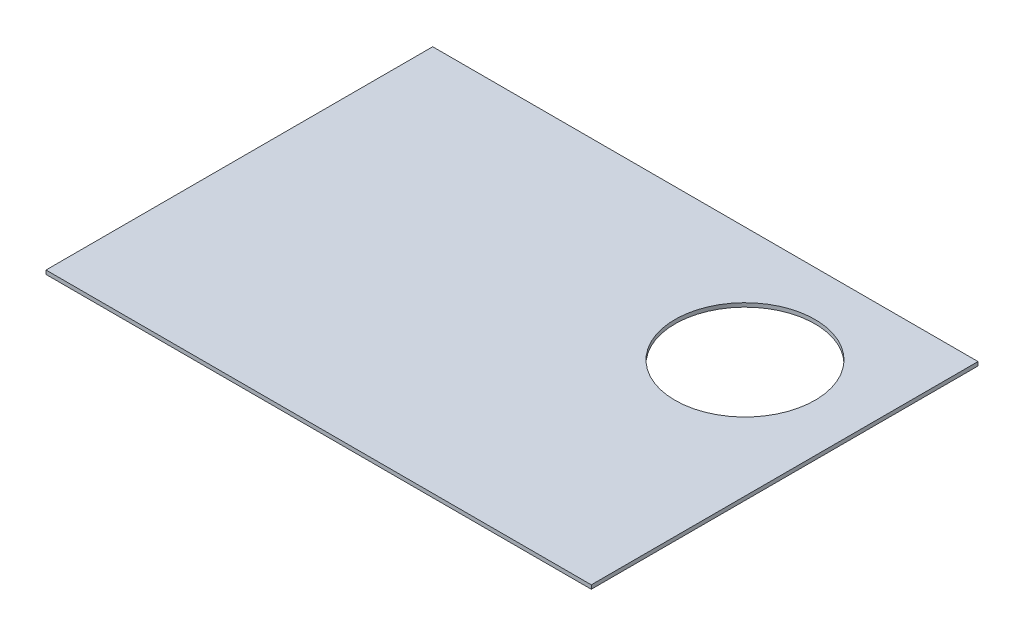
ISO-10303-21;
HEADER;
FILE_DESCRIPTION(('STEP AP214'),'2;1');
FILE_NAME('part.step','',(''),(''),'','','');
FILE_SCHEMA(('AUTOMOTIVE_DESIGN { 1 0 10303 214 1 1 1 1 }'));
ENDSEC;
DATA;
#1=APPLICATION_CONTEXT('core data for automotive mechanical design processes');
#2=APPLICATION_PROTOCOL_DEFINITION('international standard','automotive_design',2000,#1);
#3=PRODUCT_CONTEXT('',#1,'mechanical');
#4=PRODUCT('Part','Part','',(#3));
#5=PRODUCT_RELATED_PRODUCT_CATEGORY('part','',(#4));
#6=PRODUCT_DEFINITION_FORMATION('','',#4);
#7=PRODUCT_DEFINITION_CONTEXT('part definition',#1,'design');
#8=PRODUCT_DEFINITION('design','',#6,#7);
#9=PRODUCT_DEFINITION_SHAPE('','',#8);
#10=(LENGTH_UNIT() NAMED_UNIT(*) SI_UNIT(.MILLI.,.METRE.));
#11=(NAMED_UNIT(*) PLANE_ANGLE_UNIT() SI_UNIT($,.RADIAN.));
#12=(NAMED_UNIT(*) SI_UNIT($,.STERADIAN.) SOLID_ANGLE_UNIT());
#13=UNCERTAINTY_MEASURE_WITH_UNIT(LENGTH_MEASURE(1.E-05),#10,'distance_accuracy_value','');
#14=(GEOMETRIC_REPRESENTATION_CONTEXT(3) GLOBAL_UNCERTAINTY_ASSIGNED_CONTEXT((#13)) GLOBAL_UNIT_ASSIGNED_CONTEXT((#10,
#11,#12)) REPRESENTATION_CONTEXT('',''));
#15=CARTESIAN_POINT('',(0.,0.,0.));
#16=DIRECTION('',(0.,0.,1.));
#17=DIRECTION('',(1.,0.,0.));
#18=AXIS2_PLACEMENT_3D('',#15,#16,#17);
#19=CARTESIAN_POINT('',(0.,3.175,0.));
#20=DIRECTION('',(1.,0.,0.));
#21=DIRECTION('',(0.,0.,-1.));
#22=AXIS2_PLACEMENT_3D('',#19,#20,#21);
#23=PLANE('',#22);
#24=DIRECTION('',(0.,0.,1.));
#25=VECTOR('',#24,1.);
#26=CARTESIAN_POINT('',(0.,0.,0.));
#27=LINE('',#26,#25);
#28=CARTESIAN_POINT('',(0.,0.,-317.5));
#29=VERTEX_POINT('',#28);
#30=CARTESIAN_POINT('',(0.,0.,0.));
#31=VERTEX_POINT('',#30);
#32=EDGE_CURVE('E106',#29,#31,#27,.T.);
#33=ORIENTED_EDGE('',*,*,#32,.T.);
#34=DIRECTION('',(0.,-1.,0.));
#35=VECTOR('',#34,1.);
#36=CARTESIAN_POINT('',(0.,3.175,0.));
#37=LINE('',#36,#35);
#38=CARTESIAN_POINT('',(0.,3.175,0.));
#39=VERTEX_POINT('',#38);
#40=EDGE_CURVE('E11',#39,#31,#37,.T.);
#41=ORIENTED_EDGE('',*,*,#40,.F.);
#42=DIRECTION('',(0.,0.,1.));
#43=VECTOR('',#42,1.);
#44=CARTESIAN_POINT('',(0.,3.175,0.));
#45=LINE('',#44,#43);
#46=CARTESIAN_POINT('',(0.,3.175,-317.5));
#47=VERTEX_POINT('',#46);
#48=EDGE_CURVE('E92',#47,#39,#45,.T.);
#49=ORIENTED_EDGE('',*,*,#48,.F.);
#50=DIRECTION('',(0.,-1.,0.));
#51=VECTOR('',#50,1.);
#52=CARTESIAN_POINT('',(0.,3.175,-317.5));
#53=LINE('',#52,#51);
#54=EDGE_CURVE('E105',#47,#29,#53,.T.);
#55=ORIENTED_EDGE('',*,*,#54,.T.);
#56=EDGE_LOOP('',(#33,#41,#49,#55));
#57=FACE_BOUND('',#56,.T.);
#58=ADVANCED_FACE('F43',(#57),#23,.F.);
#59=CARTESIAN_POINT('',(401.6375,3.175,0.));
#60=DIRECTION('',(0.,0.,-1.));
#61=DIRECTION('',(-1.,0.,0.));
#62=AXIS2_PLACEMENT_3D('',#59,#60,#61);
#63=PLANE('',#62);
#64=DIRECTION('',(1.,0.,0.));
#65=VECTOR('',#64,1.);
#66=CARTESIAN_POINT('',(401.6375,0.,0.));
#67=LINE('',#66,#65);
#68=CARTESIAN_POINT('',(447.675,0.,0.));
#69=VERTEX_POINT('',#68);
#70=EDGE_CURVE('E96',#31,#69,#67,.T.);
#71=ORIENTED_EDGE('',*,*,#70,.T.);
#72=DIRECTION('',(0.,-1.,0.));
#73=VECTOR('',#72,1.);
#74=CARTESIAN_POINT('',(447.675,3.175,0.));
#75=LINE('',#74,#73);
#76=CARTESIAN_POINT('',(447.675,3.175,0.));
#77=VERTEX_POINT('',#76);
#78=EDGE_CURVE('E51',#77,#69,#75,.T.);
#79=ORIENTED_EDGE('',*,*,#78,.F.);
#80=DIRECTION('',(1.,0.,0.));
#81=VECTOR('',#80,1.);
#82=CARTESIAN_POINT('',(0.,3.175,0.));
#83=LINE('',#82,#81);
#84=EDGE_CURVE('E89',#39,#77,#83,.T.);
#85=ORIENTED_EDGE('',*,*,#84,.F.);
#86=ORIENTED_EDGE('',*,*,#40,.T.);
#87=EDGE_LOOP('',(#71,#79,#85,#86));
#88=FACE_BOUND('',#87,.T.);
#89=ADVANCED_FACE('F97',(#88),#63,.F.);
#90=CARTESIAN_POINT('',(447.675,3.175,0.));
#91=DIRECTION('',(-1.,0.,0.));
#92=DIRECTION('',(0.,0.,1.));
#93=AXIS2_PLACEMENT_3D('',#90,#91,#92);
#94=PLANE('',#93);
#95=DIRECTION('',(0.,0.,-1.));
#96=VECTOR('',#95,1.);
#97=CARTESIAN_POINT('',(447.675,0.,0.));
#98=LINE('',#97,#96);
#99=CARTESIAN_POINT('',(447.675,0.,-317.5));
#100=VERTEX_POINT('',#99);
#101=EDGE_CURVE('E77',#69,#100,#98,.T.);
#102=ORIENTED_EDGE('',*,*,#101,.T.);
#103=DIRECTION('',(0.,-1.,0.));
#104=VECTOR('',#103,1.);
#105=CARTESIAN_POINT('',(447.675,3.175,-317.5));
#106=LINE('',#105,#104);
#107=CARTESIAN_POINT('',(447.675,3.175,-317.5));
#108=VERTEX_POINT('',#107);
#109=EDGE_CURVE('E100',#108,#100,#106,.T.);
#110=ORIENTED_EDGE('',*,*,#109,.F.);
#111=DIRECTION('',(0.,0.,-1.));
#112=VECTOR('',#111,1.);
#113=CARTESIAN_POINT('',(447.675,3.175,0.));
#114=LINE('',#113,#112);
#115=EDGE_CURVE('E95',#77,#108,#114,.T.);
#116=ORIENTED_EDGE('',*,*,#115,.F.);
#117=ORIENTED_EDGE('',*,*,#78,.T.);
#118=EDGE_LOOP('',(#102,#110,#116,#117));
#119=FACE_BOUND('',#118,.T.);
#120=ADVANCED_FACE('F99',(#119),#94,.F.);
#121=CARTESIAN_POINT('',(0.,3.175,-317.5));
#122=DIRECTION('',(0.,0.,1.));
#123=DIRECTION('',(1.,0.,0.));
#124=AXIS2_PLACEMENT_3D('',#121,#122,#123);
#125=PLANE('',#124);
#126=DIRECTION('',(-1.,0.,0.));
#127=VECTOR('',#126,1.);
#128=CARTESIAN_POINT('',(0.,0.,-317.5));
#129=LINE('',#128,#127);
#130=EDGE_CURVE('E81',#100,#29,#129,.T.);
#131=ORIENTED_EDGE('',*,*,#130,.T.);
#132=ORIENTED_EDGE('',*,*,#54,.F.);
#133=DIRECTION('',(-1.,0.,0.));
#134=VECTOR('',#133,1.);
#135=CARTESIAN_POINT('',(0.,3.175,-317.5));
#136=LINE('',#135,#134);
#137=EDGE_CURVE('E56',#108,#47,#136,.T.);
#138=ORIENTED_EDGE('',*,*,#137,.F.);
#139=ORIENTED_EDGE('',*,*,#109,.T.);
#140=EDGE_LOOP('',(#131,#132,#138,#139));
#141=FACE_BOUND('',#140,.T.);
#142=ADVANCED_FACE('F112',(#141),#125,.F.);
#143=CARTESIAN_POINT('',(0.,3.175,0.));
#144=DIRECTION('',(0.,-1.,0.));
#145=DIRECTION('',(0.,0.,-1.));
#146=AXIS2_PLACEMENT_3D('',#143,#144,#145);
#147=PLANE('',#146);
#148=CARTESIAN_POINT('',(350.8375,3.175,-223.04375));
#149=DIRECTION('',(0.,1.,0.));
#150=DIRECTION('',(0.,0.,1.));
#151=AXIS2_PLACEMENT_3D('',#148,#149,#150);
#152=CIRCLE('',#151,57.5);
#153=CARTESIAN_POINT('',(350.8375,3.175,-165.54375));
#154=VERTEX_POINT('',#153);
#155=EDGE_CURVE('E119',#154,#154,#152,.T.);
#156=ORIENTED_EDGE('',*,*,#155,.F.);
#157=EDGE_LOOP('',(#156));
#158=FACE_BOUND('',#157,.T.);
#159=ORIENTED_EDGE('',*,*,#48,.T.);
#160=ORIENTED_EDGE('',*,*,#84,.T.);
#161=ORIENTED_EDGE('',*,*,#115,.T.);
#162=ORIENTED_EDGE('',*,*,#137,.T.);
#163=EDGE_LOOP('',(#159,#160,#161,#162));
#164=FACE_BOUND('',#163,.T.);
#165=ADVANCED_FACE('F86',(#158,#164),#147,.F.);
#166=CARTESIAN_POINT('',(0.,0.,0.));
#167=DIRECTION('',(0.,-1.,0.));
#168=DIRECTION('',(0.,0.,-1.));
#169=AXIS2_PLACEMENT_3D('',#166,#167,#168);
#170=PLANE('',#169);
#171=CARTESIAN_POINT('',(350.8375,0.,-223.04375));
#172=DIRECTION('',(0.,1.,0.));
#173=DIRECTION('',(0.,0.,1.));
#174=AXIS2_PLACEMENT_3D('',#171,#172,#173);
#175=CIRCLE('',#174,57.5);
#176=CARTESIAN_POINT('',(350.8375,0.,-165.54375));
#177=VERTEX_POINT('',#176);
#178=EDGE_CURVE('E107',#177,#177,#175,.T.);
#179=ORIENTED_EDGE('',*,*,#178,.T.);
#180=EDGE_LOOP('',(#179));
#181=FACE_BOUND('',#180,.T.);
#182=ORIENTED_EDGE('',*,*,#32,.F.);
#183=ORIENTED_EDGE('',*,*,#130,.F.);
#184=ORIENTED_EDGE('',*,*,#101,.F.);
#185=ORIENTED_EDGE('',*,*,#70,.F.);
#186=EDGE_LOOP('',(#182,#183,#184,#185));
#187=FACE_BOUND('',#186,.T.);
#188=ADVANCED_FACE('F120',(#181,#187),#170,.T.);
#189=CARTESIAN_POINT('',(350.8375,0.,-223.04375));
#190=DIRECTION('',(0.,1.,0.));
#191=DIRECTION('',(0.,0.,1.));
#192=AXIS2_PLACEMENT_3D('',#189,#190,#191);
#193=CYLINDRICAL_SURFACE('',#192,57.5);
#194=ORIENTED_EDGE('',*,*,#178,.F.);
#195=EDGE_LOOP('',(#194));
#196=FACE_BOUND('',#195,.T.);
#197=ORIENTED_EDGE('',*,*,#155,.T.);
#198=EDGE_LOOP('',(#197));
#199=FACE_BOUND('',#198,.T.);
#200=ADVANCED_FACE('F126',(#196,#199),#193,.F.);
#201=CLOSED_SHELL('',(#58,#89,#120,#142,#165,#188,#200));
#202=MANIFOLD_SOLID_BREP('B2',#201);
#203=ADVANCED_BREP_SHAPE_REPRESENTATION('',(#18,#202),#14);
#204=SHAPE_DEFINITION_REPRESENTATION(#9,#203);
ENDSEC;
END-ISO-10303-21;
